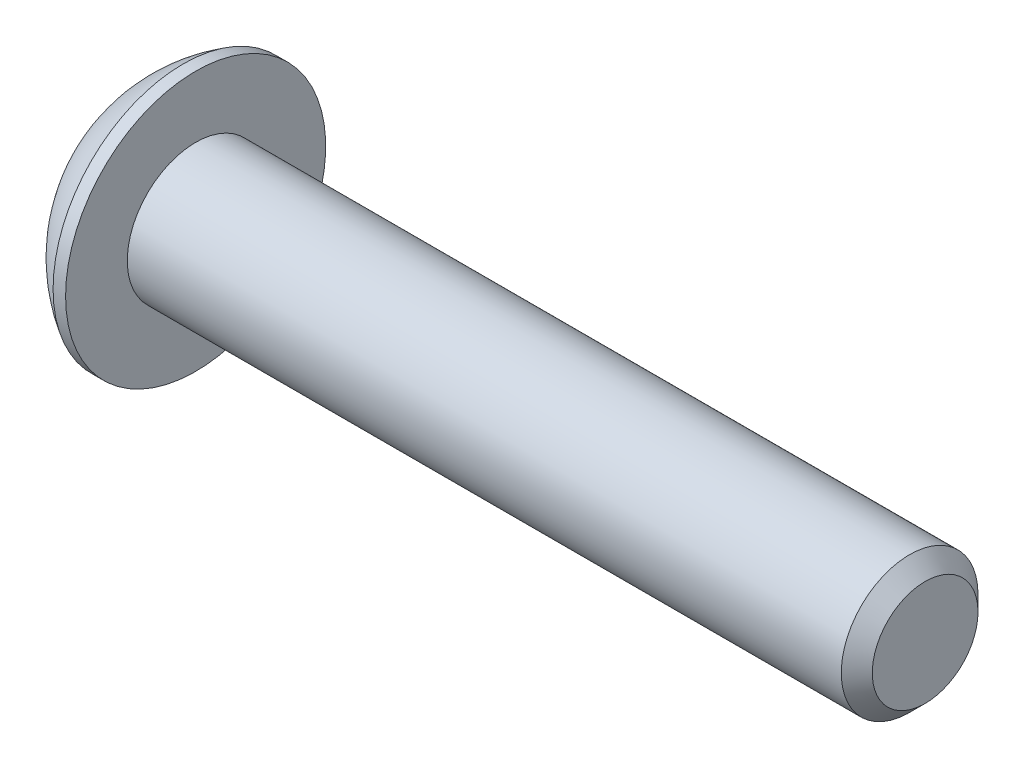
ISO-10303-21;
HEADER;
FILE_DESCRIPTION(('STEP AP214'),'2;1');
FILE_NAME('part.step','',(''),(''),'','','');
FILE_SCHEMA(('AUTOMOTIVE_DESIGN { 1 0 10303 214 1 1 1 1 }'));
ENDSEC;
DATA;
#1=APPLICATION_CONTEXT('core data for automotive mechanical design processes');
#2=APPLICATION_PROTOCOL_DEFINITION('international standard','automotive_design',2000,#1);
#3=PRODUCT_CONTEXT('',#1,'mechanical');
#4=PRODUCT('Part','Part','',(#3));
#5=PRODUCT_RELATED_PRODUCT_CATEGORY('part','',(#4));
#6=PRODUCT_DEFINITION_FORMATION('','',#4);
#7=PRODUCT_DEFINITION_CONTEXT('part definition',#1,'design');
#8=PRODUCT_DEFINITION('design','',#6,#7);
#9=PRODUCT_DEFINITION_SHAPE('','',#8);
#10=(LENGTH_UNIT() NAMED_UNIT(*) SI_UNIT(.MILLI.,.METRE.));
#11=(NAMED_UNIT(*) PLANE_ANGLE_UNIT() SI_UNIT($,.RADIAN.));
#12=(NAMED_UNIT(*) SI_UNIT($,.STERADIAN.) SOLID_ANGLE_UNIT());
#13=UNCERTAINTY_MEASURE_WITH_UNIT(LENGTH_MEASURE(1.E-05),#10,'distance_accuracy_value','');
#14=(GEOMETRIC_REPRESENTATION_CONTEXT(3) GLOBAL_UNCERTAINTY_ASSIGNED_CONTEXT((#13)) GLOBAL_UNIT_ASSIGNED_CONTEXT((#10,
#11,#12)) REPRESENTATION_CONTEXT('',''));
#15=CARTESIAN_POINT('',(0.,0.,0.));
#16=DIRECTION('',(0.,0.,1.));
#17=DIRECTION('',(1.,0.,0.));
#18=AXIS2_PLACEMENT_3D('',#15,#16,#17);
#19=CARTESIAN_POINT('',(1.3208,0.,0.));
#20=DIRECTION('',(-1.,0.,0.));
#21=DIRECTION('',(0.,0.,1.));
#22=AXIS2_PLACEMENT_3D('',#19,#20,#21);
#23=PLANE('',#22);
#24=DIRECTION('',(0.,-1.,0.));
#25=VECTOR('',#24,1.);
#26=CARTESIAN_POINT('',(1.3208,0.689240751358423,-1.1938));
#27=LINE('',#26,#25);
#28=CARTESIAN_POINT('',(1.3208,0.689240751358423,-1.1938));
#29=VERTEX_POINT('',#28);
#30=CARTESIAN_POINT('',(1.32080000031203,0.,-1.1938));
#31=VERTEX_POINT('',#30);
#32=EDGE_CURVE('E273',#29,#31,#27,.T.);
#33=ORIENTED_EDGE('',*,*,#32,.T.);
#34=CARTESIAN_POINT('',(1.32080000031203,0.,0.));
#35=DIRECTION('',(1.,0.,0.));
#36=DIRECTION('',(0.,0.,-1.));
#37=AXIS2_PLACEMENT_3D('',#34,#35,#36);
#38=CIRCLE('',#37,1.19380000017259);
#39=CARTESIAN_POINT('',(1.32080000031203,1.03386112718733,-0.596900000086297));
#40=VERTEX_POINT('',#39);
#41=EDGE_CURVE('E50',#31,#40,#38,.T.);
#42=ORIENTED_EDGE('',*,*,#41,.T.);
#43=DIRECTION('',(0.,-0.5,-0.866025403784439));
#44=VECTOR('',#43,1.);
#45=CARTESIAN_POINT('',(1.3208,1.37848150271706,1.05583800914581E-13));
#46=LINE('',#45,#44);
#47=EDGE_CURVE('E274',#40,#29,#46,.T.);
#48=ORIENTED_EDGE('',*,*,#47,.T.);
#49=EDGE_LOOP('',(#33,#42,#48));
#50=FACE_BOUND('',#49,.T.);
#51=ADVANCED_FACE('F35',(#50),#23,.T.);
#52=CARTESIAN_POINT('',(1.3208,1.37848150271706,1.05583800914581E-13));
#53=VERTEX_POINT('',#52);
#54=EDGE_CURVE('E264',#53,#40,#46,.T.);
#55=ORIENTED_EDGE('',*,*,#54,.T.);
#56=CARTESIAN_POINT('',(1.32080000031203,1.03386112718732,0.596900000086317));
#57=VERTEX_POINT('',#56);
#58=EDGE_CURVE('E199',#40,#57,#38,.T.);
#59=ORIENTED_EDGE('',*,*,#58,.T.);
#60=DIRECTION('',(0.,0.500000000000017,-0.866025403784429));
#61=VECTOR('',#60,1.);
#62=CARTESIAN_POINT('',(1.3208,0.689240751358514,1.1938));
#63=LINE('',#62,#61);
#64=EDGE_CURVE('E277',#57,#53,#63,.T.);
#65=ORIENTED_EDGE('',*,*,#64,.T.);
#66=EDGE_LOOP('',(#55,#59,#65));
#67=FACE_BOUND('',#66,.T.);
#68=ADVANCED_FACE('F122',(#67),#23,.T.);
#69=CARTESIAN_POINT('',(1.3208,0.689240751358514,1.1938));
#70=VERTEX_POINT('',#69);
#71=EDGE_CURVE('E275',#70,#57,#63,.T.);
#72=ORIENTED_EDGE('',*,*,#71,.T.);
#73=CARTESIAN_POINT('',(1.32080000031203,0.,1.19380000017259));
#74=VERTEX_POINT('',#73);
#75=EDGE_CURVE('E202',#57,#74,#38,.T.);
#76=ORIENTED_EDGE('',*,*,#75,.T.);
#77=DIRECTION('',(0.,1.,0.));
#78=VECTOR('',#77,1.);
#79=CARTESIAN_POINT('',(1.3208,-0.689240751358479,1.19379999999998));
#80=LINE('',#79,#78);
#81=EDGE_CURVE('E251',#74,#70,#80,.T.);
#82=ORIENTED_EDGE('',*,*,#81,.T.);
#83=EDGE_LOOP('',(#72,#76,#82));
#84=FACE_BOUND('',#83,.T.);
#85=ADVANCED_FACE('F127',(#84),#23,.T.);
#86=CARTESIAN_POINT('',(1.3208,-0.689240751358479,1.19379999999998));
#87=VERTEX_POINT('',#86);
#88=EDGE_CURVE('E225',#87,#74,#80,.T.);
#89=ORIENTED_EDGE('',*,*,#88,.T.);
#90=CARTESIAN_POINT('',(1.32080000031203,-1.03386112718733,0.596900000086298));
#91=VERTEX_POINT('',#90);
#92=EDGE_CURVE('E207',#74,#91,#38,.T.);
#93=ORIENTED_EDGE('',*,*,#92,.T.);
#94=DIRECTION('',(0.,0.500000000000001,0.866025403784438));
#95=VECTOR('',#94,1.);
#96=CARTESIAN_POINT('',(1.3208,-1.37848150271706,0.));
#97=LINE('',#96,#95);
#98=EDGE_CURVE('E222',#91,#87,#97,.T.);
#99=ORIENTED_EDGE('',*,*,#98,.T.);
#100=EDGE_LOOP('',(#89,#93,#99));
#101=FACE_BOUND('',#100,.T.);
#102=ADVANCED_FACE('F178',(#101),#23,.T.);
#103=CARTESIAN_POINT('',(1.3208,-1.37848150271706,0.));
#104=VERTEX_POINT('',#103);
#105=EDGE_CURVE('E228',#104,#91,#97,.T.);
#106=ORIENTED_EDGE('',*,*,#105,.T.);
#107=CARTESIAN_POINT('',(1.32080000031203,-1.03386112718734,-0.596900000086287));
#108=VERTEX_POINT('',#107);
#109=EDGE_CURVE('E212',#91,#108,#38,.T.);
#110=ORIENTED_EDGE('',*,*,#109,.T.);
#111=DIRECTION('',(0.,-0.499999999999992,0.866025403784443));
#112=VECTOR('',#111,1.);
#113=CARTESIAN_POINT('',(1.3208,-0.689240751358514,-1.1938));
#114=LINE('',#113,#112);
#115=EDGE_CURVE('E231',#108,#104,#114,.T.);
#116=ORIENTED_EDGE('',*,*,#115,.T.);
#117=EDGE_LOOP('',(#106,#110,#116));
#118=FACE_BOUND('',#117,.T.);
#119=ADVANCED_FACE('F120',(#118),#23,.T.);
#120=CARTESIAN_POINT('',(2.2098,0.,0.));
#121=DIRECTION('',(-1.,0.,0.));
#122=DIRECTION('',(0.,0.,1.));
#123=AXIS2_PLACEMENT_3D('',#120,#121,#122);
#124=CYLINDRICAL_SURFACE('',#123,3.9624);
#125=CARTESIAN_POINT('',(2.2098,0.,0.));
#126=DIRECTION('',(-1.,0.,0.));
#127=DIRECTION('',(0.,0.,1.));
#128=AXIS2_PLACEMENT_3D('',#125,#126,#127);
#129=CIRCLE('',#128,3.9624);
#130=CARTESIAN_POINT('',(2.2098,0.,3.9624));
#131=VERTEX_POINT('',#130);
#132=EDGE_CURVE('E183',#131,#131,#129,.T.);
#133=ORIENTED_EDGE('',*,*,#132,.T.);
#134=EDGE_LOOP('',(#133));
#135=FACE_BOUND('',#134,.T.);
#136=CARTESIAN_POINT('',(1.8287999999999,0.,0.));
#137=DIRECTION('',(-1.,0.,0.));
#138=DIRECTION('',(0.,0.,1.));
#139=AXIS2_PLACEMENT_3D('',#136,#137,#138);
#140=CIRCLE('',#139,3.9624);
#141=CARTESIAN_POINT('',(1.8287999999999,3.9624,0.));
#142=VERTEX_POINT('',#141);
#143=EDGE_CURVE('E186',#142,#142,#140,.T.);
#144=ORIENTED_EDGE('',*,*,#143,.F.);
#145=EDGE_LOOP('',(#144));
#146=FACE_BOUND('',#145,.T.);
#147=ADVANCED_FACE('F171',(#135,#146),#124,.T.);
#148=CARTESIAN_POINT('',(2.2098,3.9624,0.));
#149=DIRECTION('',(1.,0.,0.));
#150=DIRECTION('',(0.,0.,-1.));
#151=AXIS2_PLACEMENT_3D('',#148,#149,#150);
#152=PLANE('',#151);
#153=CARTESIAN_POINT('',(2.2098,0.,0.));
#154=DIRECTION('',(1.,0.,0.));
#155=DIRECTION('',(0.,0.,-1.));
#156=AXIS2_PLACEMENT_3D('',#153,#154,#155);
#157=CIRCLE('',#156,2.0828);
#158=CARTESIAN_POINT('',(2.2098,0.,-2.0828));
#159=VERTEX_POINT('',#158);
#160=EDGE_CURVE('E188',#159,#159,#157,.T.);
#161=ORIENTED_EDGE('',*,*,#160,.F.);
#162=EDGE_LOOP('',(#161));
#163=FACE_BOUND('',#162,.T.);
#164=ORIENTED_EDGE('',*,*,#132,.F.);
#165=EDGE_LOOP('',(#164));
#166=FACE_BOUND('',#165,.T.);
#167=ADVANCED_FACE('F168',(#163,#166),#152,.T.);
#168=CARTESIAN_POINT('',(0.,0.,0.));
#169=DIRECTION('',(-1.,0.,0.));
#170=DIRECTION('',(0.,0.,1.));
#171=AXIS2_PLACEMENT_3D('',#168,#169,#170);
#172=PLANE('',#171);
#173=DIRECTION('',(0.,1.,0.));
#174=VECTOR('',#173,1.);
#175=CARTESIAN_POINT('',(0.,-0.689240751358479,1.19379999999998));
#176=LINE('',#175,#174);
#177=CARTESIAN_POINT('',(0.,-0.689240751358479,1.19379999999998));
#178=VERTEX_POINT('',#177);
#179=CARTESIAN_POINT('',(0.,0.689240751358514,1.1938));
#180=VERTEX_POINT('',#179);
#181=EDGE_CURVE('E58',#178,#180,#176,.T.);
#182=ORIENTED_EDGE('',*,*,#181,.F.);
#183=DIRECTION('',(0.,0.500000000000001,0.866025403784438));
#184=VECTOR('',#183,1.);
#185=CARTESIAN_POINT('',(0.,-1.37848150271706,0.));
#186=LINE('',#185,#184);
#187=CARTESIAN_POINT('',(0.,-1.37848150271706,0.));
#188=VERTEX_POINT('',#187);
#189=EDGE_CURVE('E249',#188,#178,#186,.T.);
#190=ORIENTED_EDGE('',*,*,#189,.F.);
#191=DIRECTION('',(0.,-0.499999999999992,0.866025403784443));
#192=VECTOR('',#191,1.);
#193=CARTESIAN_POINT('',(0.,-0.689240751358514,-1.1938));
#194=LINE('',#193,#192);
#195=CARTESIAN_POINT('',(0.,-0.689240751358514,-1.1938));
#196=VERTEX_POINT('',#195);
#197=EDGE_CURVE('E246',#196,#188,#194,.T.);
#198=ORIENTED_EDGE('',*,*,#197,.F.);
#199=DIRECTION('',(0.,-1.,0.));
#200=VECTOR('',#199,1.);
#201=CARTESIAN_POINT('',(0.,0.689240751358423,-1.1938));
#202=LINE('',#201,#200);
#203=CARTESIAN_POINT('',(0.,0.689240751358423,-1.1938));
#204=VERTEX_POINT('',#203);
#205=EDGE_CURVE('E243',#204,#196,#202,.T.);
#206=ORIENTED_EDGE('',*,*,#205,.F.);
#207=DIRECTION('',(0.,-0.5,-0.866025403784439));
#208=VECTOR('',#207,1.);
#209=CARTESIAN_POINT('',(0.,1.37848150271706,1.05583800914581E-13));
#210=LINE('',#209,#208);
#211=CARTESIAN_POINT('',(0.,1.37848150271706,1.05583800914581E-13));
#212=VERTEX_POINT('',#211);
#213=EDGE_CURVE('E240',#212,#204,#210,.T.);
#214=ORIENTED_EDGE('',*,*,#213,.F.);
#215=DIRECTION('',(0.,0.500000000000017,-0.866025403784429));
#216=VECTOR('',#215,1.);
#217=CARTESIAN_POINT('',(0.,0.689240751358514,1.1938));
#218=LINE('',#217,#216);
#219=EDGE_CURVE('E210',#180,#212,#218,.T.);
#220=ORIENTED_EDGE('',*,*,#219,.F.);
#221=EDGE_LOOP('',(#182,#190,#198,#206,#214,#220));
#222=FACE_BOUND('',#221,.T.);
#223=CARTESIAN_POINT('',(0.,0.,0.));
#224=DIRECTION('',(-1.,0.,0.));
#225=DIRECTION('',(0.,0.,1.));
#226=AXIS2_PLACEMENT_3D('',#223,#224,#225);
#227=CIRCLE('',#226,1.98120000000011);
#228=CARTESIAN_POINT('',(0.,1.98120000000011,0.));
#229=VERTEX_POINT('',#228);
#230=EDGE_CURVE('E187',#229,#229,#227,.T.);
#231=ORIENTED_EDGE('',*,*,#230,.T.);
#232=EDGE_LOOP('',(#231));
#233=FACE_BOUND('',#232,.T.);
#234=ADVANCED_FACE('F164',(#222,#233),#172,.T.);
#235=CARTESIAN_POINT('',(4.13385,0.,0.));
#236=DIRECTION('',(-1.,0.,0.));
#237=DIRECTION('',(0.,1.,0.));
#238=AXIS2_PLACEMENT_3D('',#235,#236,#237);
#239=SPHERICAL_SURFACE('',#238,4.58408870578444);
#240=CARTESIAN_POINT('',(1.8287999999999,3.9624,0.));
#241=CARTESIAN_POINT('',(1.80415889596794,3.94806555004249,0.));
#242=CARTESIAN_POINT('',(1.77965153901298,3.93350118989005,0.));
#243=CARTESIAN_POINT('',(1.73091277312723,3.90391784301183,0.));
#244=CARTESIAN_POINT('',(1.70668136419644,3.88889885628605,0.));
#245=CARTESIAN_POINT('',(1.65850294822919,3.85841145007764,0.));
#246=CARTESIAN_POINT('',(1.63455594119272,3.84294303059502,0.));
#247=CARTESIAN_POINT('',(1.58695465816584,3.81156215150891,0.));
#248=CARTESIAN_POINT('',(1.56330038217543,3.79564969190541,0.));
#249=CARTESIAN_POINT('',(1.51629279540485,3.76338626839824,0.));
#250=CARTESIAN_POINT('',(1.49293948462469,3.74703530449456,0.));
#251=CARTESIAN_POINT('',(1.44654195584231,3.71390056387007,0.));
#252=CARTESIAN_POINT('',(1.4234977378401,3.69711678714927,0.));
#253=CARTESIAN_POINT('',(1.37772641509881,3.66312226219549,0.));
#254=CARTESIAN_POINT('',(1.35499931035972,3.64591151396251,0.));
#255=CARTESIAN_POINT('',(1.30987012412812,3.61106903611233,0.));
#256=CARTESIAN_POINT('',(1.28746804263561,3.59343730649513,0.));
#257=CARTESIAN_POINT('',(1.24299669979404,3.55775900246559,0.));
#258=CARTESIAN_POINT('',(1.220927438445,3.53971242805324,0.));
#259=CARTESIAN_POINT('',(1.177129416942,3.50321071542201,0.));
#260=CARTESIAN_POINT('',(1.15540065678804,3.48475557720312,0.));
#261=CARTESIAN_POINT('',(1.11229120022032,3.44744316014103,0.));
#262=CARTESIAN_POINT('',(1.09091050380655,3.42858588129782,0.));
#263=CARTESIAN_POINT('',(1.04850461612244,3.39047574613267,0.));
#264=CARTESIAN_POINT('',(1.0274794248521,3.37122288981073,0.));
#265=CARTESIAN_POINT('',(0.985791865127142,3.33232830051144,0.));
#266=CARTESIAN_POINT('',(0.965129496672533,3.31268656753408,0.));
#267=CARTESIAN_POINT('',(0.924174773973347,3.27302106109315,0.));
#268=CARTESIAN_POINT('',(0.90388241972877,3.25299728762958,0.));
#269=CARTESIAN_POINT('',(0.863674788063073,3.21257466935196,0.));
#270=CARTESIAN_POINT('',(0.843759510641952,3.19217582453791,0.));
#271=CARTESIAN_POINT('',(0.804312963997608,3.15101016323607,0.));
#272=CARTESIAN_POINT('',(0.784781694774386,3.13024334674827,0.));
#273=CARTESIAN_POINT('',(0.746109962248888,3.08834896984565,0.));
#274=CARTESIAN_POINT('',(0.726969498946613,3.06722140943083,0.));
#275=CARTESIAN_POINT('',(0.689086039968763,3.0246128979753,0.));
#276=CARTESIAN_POINT('',(0.670343044293189,3.00313194693459,0.));
#277=CARTESIAN_POINT('',(0.633261043938637,2.9598241305236,0.));
#278=CARTESIAN_POINT('',(0.61492203925966,2.93799726515333,0.));
#279=CARTESIAN_POINT('',(0.578654403661928,2.89400521677259,0.));
#280=CARTESIAN_POINT('',(0.560725772743172,2.87184003376214,0.));
#281=CARTESIAN_POINT('',(0.525285124601779,2.82717906453956,0.));
#282=CARTESIAN_POINT('',(0.507773107379143,2.80468327832743,0.));
#283=CARTESIAN_POINT('',(0.47317178156629,2.7593689322042,0.));
#284=CARTESIAN_POINT('',(0.456082472976073,2.7365503722931,0.));
#285=CARTESIAN_POINT('',(0.422332512243865,2.6905984206136,0.));
#286=CARTESIAN_POINT('',(0.405671860101872,2.66746502884521,0.));
#287=CARTESIAN_POINT('',(0.372785010889828,2.62089146486848,0.));
#288=CARTESIAN_POINT('',(0.356558813819776,2.59745129266014,0.));
#289=CARTESIAN_POINT('',(0.324546522170643,2.55027232599143,0.));
#290=CARTESIAN_POINT('',(0.308760427591562,2.52653353153106,0.));
#291=CARTESIAN_POINT('',(0.277633835152375,2.47876558248789,0.));
#292=CARTESIAN_POINT('',(0.262293337292268,2.45473642790508,0.));
#293=CARTESIAN_POINT('',(0.232063277493394,2.40639612177368,0.));
#294=CARTESIAN_POINT('',(0.217173715554625,2.38208497022508,0.));
#295=CARTESIAN_POINT('',(0.187850709627215,2.33318913158063,0.));
#296=CARTESIAN_POINT('',(0.173417265638573,2.30860444448478,0.));
#297=CARTESIAN_POINT('',(0.145011519744086,2.25917009093813,0.));
#298=CARTESIAN_POINT('',(0.131039217838242,2.23432042448734,0.));
#299=CARTESIAN_POINT('',(0.103560616562857,2.18436476224601,0.));
#300=CARTESIAN_POINT('',(0.0900543171933165,2.15925876645546,0.));
#301=CARTESIAN_POINT('',(0.0635124311299278,2.10879917879733,0.));
#302=CARTESIAN_POINT('',(0.0504768444360798,2.08344558692975,0.));
#303=CARTESIAN_POINT('',(0.0248808857176734,2.03249964882014,0.));
#304=CARTESIAN_POINT('',(0.012320513693115,2.0069073025781,0.));
#305=CARTESIAN_POINT('',(0.,1.98120000000011,0.));
#306=B_SPLINE_CURVE_WITH_KNOTS('',3,(#240,#241,#242,#243,#244,#245,#246,#247,#248,#249,#250,
#251,#252,#253,#254,#255,#256,#257,#258,#259,#260,#261,#262,#263,#264,#265,#266,#267,#268,#269,
#270,#271,#272,#273,#274,#275,#276,#277,#278,#279,#280,#281,#282,#283,#284,#285,#286,#287,#288,
#289,#290,#291,#292,#293,#294,#295,#296,#297,#298,#299,#300,#301,#302,#303,#304,#305),
.UNSPECIFIED.,.F.,.F.,(4,2,2,2,2,2,2,2,2,2,2,2,2,2,2,2,2,2,2,2,2,2,2,2,2,2,2,2,2,2,2,2,4),(0.,
0.08552035856354,0.171040717127081,0.256561075690621,0.342081434254161,0.427601792817702,
0.513122151381242,0.598642509944782,0.684162868508322,0.769683227071863,0.855203585635403,
0.940723944198943,1.02624430276248,1.11176466132602,1.19728501988956,1.2828053784531,
1.36832573701664,1.45384609558019,1.53936645414373,1.62488681270727,1.71040717127081,
1.79592752983435,1.88144788839789,1.96696824696143,2.05248860552497,2.13800896408851,
2.22352932265205,2.30904968121559,2.39457003977913,2.48009039834267,2.56561075690621,
2.65113111546975,2.73665147403329),.UNSPECIFIED.);
#307=EDGE_CURVE('BSEAM160',#142,#229,#306,.T.);
#308=ORIENTED_EDGE('',*,*,#143,.T.);
#309=ORIENTED_EDGE('',*,*,#230,.F.);
#310=ORIENTED_EDGE('',*,*,#307,.T.);
#311=ORIENTED_EDGE('',*,*,#307,.F.);
#312=EDGE_LOOP('',(#308,#310,#309,#311));
#313=FACE_BOUND('',#312,.T.);
#314=ADVANCED_FACE('F160',(#313),#239,.T.);
#315=CARTESIAN_POINT('',(24.4348,0.,0.));
#316=DIRECTION('',(-1.,0.,0.));
#317=DIRECTION('',(0.,0.,1.));
#318=AXIS2_PLACEMENT_3D('',#315,#316,#317);
#319=CYLINDRICAL_SURFACE('',#318,2.0828);
#320=CARTESIAN_POINT('',(23.962359999936,0.,0.));
#321=DIRECTION('',(1.,0.,0.));
#322=DIRECTION('',(0.,0.,-1.));
#323=AXIS2_PLACEMENT_3D('',#320,#321,#322);
#324=CIRCLE('',#323,2.0828);
#325=CARTESIAN_POINT('',(23.962359999936,0.,-2.0828));
#326=VERTEX_POINT('',#325);
#327=EDGE_CURVE('E11',#326,#326,#324,.F.);
#328=ORIENTED_EDGE('',*,*,#327,.T.);
#329=EDGE_LOOP('',(#328));
#330=FACE_BOUND('',#329,.T.);
#331=ORIENTED_EDGE('',*,*,#160,.T.);
#332=EDGE_LOOP('',(#331));
#333=FACE_BOUND('',#332,.T.);
#334=ADVANCED_FACE('F156',(#330,#333),#319,.T.);
#335=CARTESIAN_POINT('',(24.4348,0.,0.));
#336=DIRECTION('',(1.,0.,0.));
#337=DIRECTION('',(0.,0.,-1.));
#338=AXIS2_PLACEMENT_3D('',#335,#336,#337);
#339=PLANE('',#338);
#340=CARTESIAN_POINT('',(24.4348,0.,0.));
#341=DIRECTION('',(1.,0.,0.));
#342=DIRECTION('',(0.,0.,-1.));
#343=AXIS2_PLACEMENT_3D('',#340,#341,#342);
#344=CIRCLE('',#343,1.61035999993596);
#345=CARTESIAN_POINT('',(24.4348,0.,-1.61035999993596));
#346=VERTEX_POINT('',#345);
#347=EDGE_CURVE('E43',#346,#346,#344,.T.);
#348=ORIENTED_EDGE('',*,*,#347,.T.);
#349=EDGE_LOOP('',(#348));
#350=FACE_BOUND('',#349,.T.);
#351=ADVANCED_FACE('F153',(#350),#339,.T.);
#352=CARTESIAN_POINT('',(1.3208,-0.689240751358479,1.19379999999998));
#353=DIRECTION('',(0.,0.,1.));
#354=DIRECTION('',(0.,-1.,0.));
#355=AXIS2_PLACEMENT_3D('',#352,#353,#354);
#356=PLANE('',#355);
#357=ORIENTED_EDGE('',*,*,#181,.T.);
#358=DIRECTION('',(-1.,0.,0.));
#359=VECTOR('',#358,1.);
#360=CARTESIAN_POINT('',(1.3208,0.689240751358514,1.1938));
#361=LINE('',#360,#359);
#362=EDGE_CURVE('E233',#70,#180,#361,.T.);
#363=ORIENTED_EDGE('',*,*,#362,.F.);
#364=ORIENTED_EDGE('',*,*,#81,.F.);
#365=ORIENTED_EDGE('',*,*,#88,.F.);
#366=DIRECTION('',(-1.,0.,0.));
#367=VECTOR('',#366,1.);
#368=CARTESIAN_POINT('',(1.3208,-0.689240751358479,1.19379999999998));
#369=LINE('',#368,#367);
#370=EDGE_CURVE('E193',#87,#178,#369,.T.);
#371=ORIENTED_EDGE('',*,*,#370,.T.);
#372=EDGE_LOOP('',(#357,#363,#364,#365,#371));
#373=FACE_BOUND('',#372,.T.);
#374=ADVANCED_FACE('F135',(#373),#356,.F.);
#375=CARTESIAN_POINT('',(1.3208,-1.37848150271706,0.));
#376=DIRECTION('',(0.,-0.866025403784438,0.500000000000001));
#377=DIRECTION('',(0.,-0.500000000000001,-0.866025403784438));
#378=AXIS2_PLACEMENT_3D('',#375,#376,#377);
#379=PLANE('',#378);
#380=ORIENTED_EDGE('',*,*,#189,.T.);
#381=ORIENTED_EDGE('',*,*,#370,.F.);
#382=ORIENTED_EDGE('',*,*,#98,.F.);
#383=ORIENTED_EDGE('',*,*,#105,.F.);
#384=DIRECTION('',(-1.,0.,0.));
#385=VECTOR('',#384,1.);
#386=CARTESIAN_POINT('',(1.3208,-1.37848150271706,0.));
#387=LINE('',#386,#385);
#388=EDGE_CURVE('E253',#104,#188,#387,.T.);
#389=ORIENTED_EDGE('',*,*,#388,.T.);
#390=EDGE_LOOP('',(#380,#381,#382,#383,#389));
#391=FACE_BOUND('',#390,.T.);
#392=ADVANCED_FACE('F131',(#391),#379,.F.);
#393=CARTESIAN_POINT('',(1.3208,-0.689240751358514,-1.1938));
#394=DIRECTION('',(0.,-0.866025403784443,-0.499999999999992));
#395=DIRECTION('',(0.,0.499999999999992,-0.866025403784443));
#396=AXIS2_PLACEMENT_3D('',#393,#394,#395);
#397=PLANE('',#396);
#398=ORIENTED_EDGE('',*,*,#197,.T.);
#399=ORIENTED_EDGE('',*,*,#388,.F.);
#400=ORIENTED_EDGE('',*,*,#115,.F.);
#401=CARTESIAN_POINT('',(1.3208,-0.689240751358514,-1.1938));
#402=VERTEX_POINT('',#401);
#403=EDGE_CURVE('E229',#402,#108,#114,.T.);
#404=ORIENTED_EDGE('',*,*,#403,.F.);
#405=DIRECTION('',(-1.,0.,0.));
#406=VECTOR('',#405,1.);
#407=CARTESIAN_POINT('',(1.3208,-0.689240751358514,-1.1938));
#408=LINE('',#407,#406);
#409=EDGE_CURVE('E255',#402,#196,#408,.T.);
#410=ORIENTED_EDGE('',*,*,#409,.T.);
#411=EDGE_LOOP('',(#398,#399,#400,#404,#410));
#412=FACE_BOUND('',#411,.T.);
#413=ADVANCED_FACE('F134',(#412),#397,.F.);
#414=CARTESIAN_POINT('',(1.3208,0.689240751358423,-1.1938));
#415=DIRECTION('',(0.,0.,-1.));
#416=DIRECTION('',(-1.,0.,0.));
#417=AXIS2_PLACEMENT_3D('',#414,#415,#416);
#418=PLANE('',#417);
#419=ORIENTED_EDGE('',*,*,#205,.T.);
#420=ORIENTED_EDGE('',*,*,#409,.F.);
#421=EDGE_CURVE('E278',#31,#402,#27,.T.);
#422=ORIENTED_EDGE('',*,*,#421,.F.);
#423=ORIENTED_EDGE('',*,*,#32,.F.);
#424=DIRECTION('',(-1.,0.,0.));
#425=VECTOR('',#424,1.);
#426=CARTESIAN_POINT('',(1.3208,0.689240751358423,-1.1938));
#427=LINE('',#426,#425);
#428=EDGE_CURVE('E257',#29,#204,#427,.T.);
#429=ORIENTED_EDGE('',*,*,#428,.T.);
#430=EDGE_LOOP('',(#419,#420,#422,#423,#429));
#431=FACE_BOUND('',#430,.T.);
#432=ADVANCED_FACE('F139',(#431),#418,.F.);
#433=CARTESIAN_POINT('',(1.3208,1.37848150271706,1.05583800914581E-13));
#434=DIRECTION('',(0.,0.866025403784439,-0.5));
#435=DIRECTION('',(0.,0.5,0.866025403784439));
#436=AXIS2_PLACEMENT_3D('',#433,#434,#435);
#437=PLANE('',#436);
#438=ORIENTED_EDGE('',*,*,#213,.T.);
#439=ORIENTED_EDGE('',*,*,#428,.F.);
#440=ORIENTED_EDGE('',*,*,#47,.F.);
#441=ORIENTED_EDGE('',*,*,#54,.F.);
#442=DIRECTION('',(-1.,0.,0.));
#443=VECTOR('',#442,1.);
#444=CARTESIAN_POINT('',(1.3208,1.37848150271706,1.05583800914581E-13));
#445=LINE('',#444,#443);
#446=EDGE_CURVE('E234',#53,#212,#445,.T.);
#447=ORIENTED_EDGE('',*,*,#446,.T.);
#448=EDGE_LOOP('',(#438,#439,#440,#441,#447));
#449=FACE_BOUND('',#448,.T.);
#450=ADVANCED_FACE('F143',(#449),#437,.F.);
#451=CARTESIAN_POINT('',(1.3208,0.689240751358514,1.1938));
#452=DIRECTION('',(0.,0.866025403784429,0.500000000000017));
#453=DIRECTION('',(0.,-0.500000000000017,0.866025403784429));
#454=AXIS2_PLACEMENT_3D('',#451,#452,#453);
#455=PLANE('',#454);
#456=ORIENTED_EDGE('',*,*,#219,.T.);
#457=ORIENTED_EDGE('',*,*,#446,.F.);
#458=ORIENTED_EDGE('',*,*,#64,.F.);
#459=ORIENTED_EDGE('',*,*,#71,.F.);
#460=ORIENTED_EDGE('',*,*,#362,.T.);
#461=EDGE_LOOP('',(#456,#457,#458,#459,#460));
#462=FACE_BOUND('',#461,.T.);
#463=ADVANCED_FACE('F117',(#462),#455,.F.);
#464=ORIENTED_EDGE('',*,*,#403,.T.);
#465=EDGE_CURVE('E197',#108,#31,#38,.T.);
#466=ORIENTED_EDGE('',*,*,#465,.T.);
#467=ORIENTED_EDGE('',*,*,#421,.T.);
#468=EDGE_LOOP('',(#464,#466,#467));
#469=FACE_BOUND('',#468,.T.);
#470=ADVANCED_FACE('F110',(#469),#23,.T.);
#471=CARTESIAN_POINT('',(2.01004075177025,0.,0.));
#472=DIRECTION('',(-1.,0.,0.));
#473=DIRECTION('',(0.,0.,1.));
#474=AXIS2_PLACEMENT_3D('',#471,#472,#473);
#475=CONICAL_SURFACE('',#474,0.,1.0471975511966);
#476=ORIENTED_EDGE('',*,*,#41,.F.);
#477=ORIENTED_EDGE('',*,*,#465,.F.);
#478=ORIENTED_EDGE('',*,*,#109,.F.);
#479=ORIENTED_EDGE('',*,*,#92,.F.);
#480=ORIENTED_EDGE('',*,*,#75,.F.);
#481=ORIENTED_EDGE('',*,*,#58,.F.);
#482=EDGE_LOOP('',(#476,#477,#478,#479,#480,#481));
#483=FACE_BOUND('',#482,.T.);
#484=CARTESIAN_POINT('',(2.01004075177025,0.,0.));
#485=VERTEX_POINT('',#484);
#486=VERTEX_LOOP('',#485);
#487=FACE_BOUND('',#486,.T.);
#488=ADVANCED_FACE('F108',(#483,#487),#475,.F.);
#489=CARTESIAN_POINT('',(24.4348,0.,0.));
#490=DIRECTION('',(-1.,0.,0.));
#491=DIRECTION('',(0.,0.,1.));
#492=AXIS2_PLACEMENT_3D('',#489,#490,#491);
#493=CONICAL_SURFACE('',#492,1.61035999993596,0.785398163397446);
#494=ORIENTED_EDGE('',*,*,#327,.F.);
#495=EDGE_LOOP('',(#494));
#496=FACE_BOUND('',#495,.T.);
#497=ORIENTED_EDGE('',*,*,#347,.F.);
#498=EDGE_LOOP('',(#497));
#499=FACE_BOUND('',#498,.T.);
#500=ADVANCED_FACE('F37',(#496,#499),#493,.T.);
#501=CLOSED_SHELL('',(#51,#68,#85,#102,#119,#147,#167,#234,#314,#334,#351,#374,#392,#413,#432,
#450,#463,#470,#488,#500));
#502=MANIFOLD_SOLID_BREP('B2',#501);
#503=ADVANCED_BREP_SHAPE_REPRESENTATION('',(#18,#502),#14);
#504=SHAPE_DEFINITION_REPRESENTATION(#9,#503);
ENDSEC;
END-ISO-10303-21;
